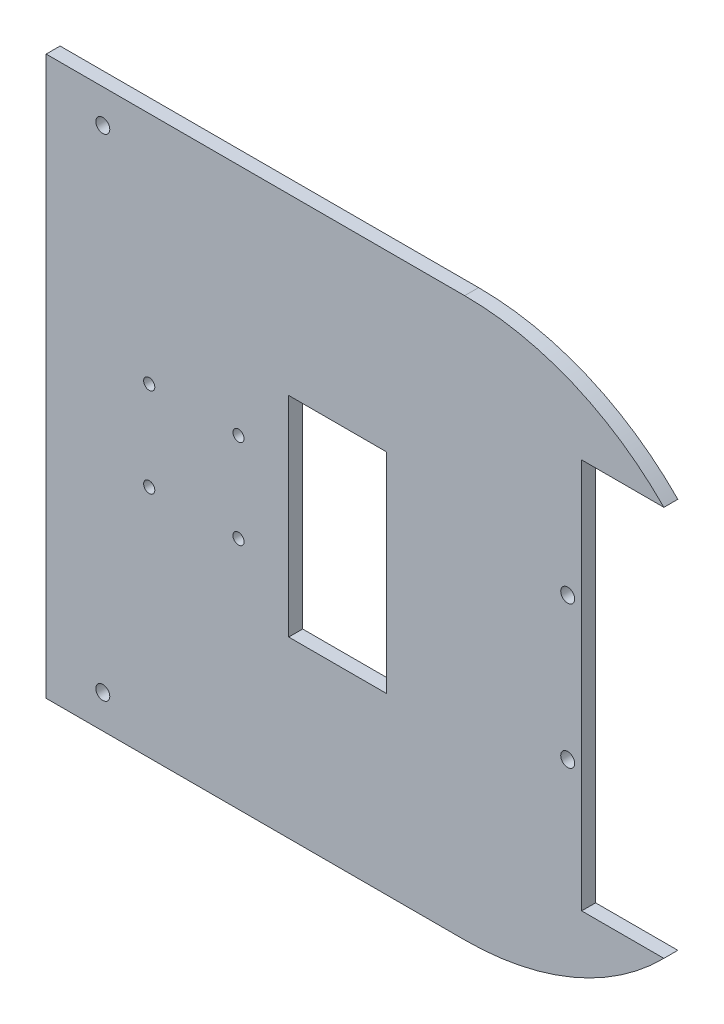
ISO-10303-21;
HEADER;
FILE_DESCRIPTION(('STEP AP214'),'2;1');
FILE_NAME('part.step','',(''),(''),'','','');
FILE_SCHEMA(('AUTOMOTIVE_DESIGN { 1 0 10303 214 1 1 1 1 }'));
ENDSEC;
DATA;
#1=APPLICATION_CONTEXT('core data for automotive mechanical design processes');
#2=APPLICATION_PROTOCOL_DEFINITION('international standard','automotive_design',2000,#1);
#3=PRODUCT_CONTEXT('',#1,'mechanical');
#4=PRODUCT('Part','Part','',(#3));
#5=PRODUCT_RELATED_PRODUCT_CATEGORY('part','',(#4));
#6=PRODUCT_DEFINITION_FORMATION('','',#4);
#7=PRODUCT_DEFINITION_CONTEXT('part definition',#1,'design');
#8=PRODUCT_DEFINITION('design','',#6,#7);
#9=PRODUCT_DEFINITION_SHAPE('','',#8);
#10=(LENGTH_UNIT() NAMED_UNIT(*) SI_UNIT(.MILLI.,.METRE.));
#11=(NAMED_UNIT(*) PLANE_ANGLE_UNIT() SI_UNIT($,.RADIAN.));
#12=(NAMED_UNIT(*) SI_UNIT($,.STERADIAN.) SOLID_ANGLE_UNIT());
#13=UNCERTAINTY_MEASURE_WITH_UNIT(LENGTH_MEASURE(1.E-05),#10,'distance_accuracy_value','');
#14=(GEOMETRIC_REPRESENTATION_CONTEXT(3) GLOBAL_UNCERTAINTY_ASSIGNED_CONTEXT((#13)) GLOBAL_UNIT_ASSIGNED_CONTEXT((#10,
#11,#12)) REPRESENTATION_CONTEXT('',''));
#15=CARTESIAN_POINT('',(0.,0.,0.));
#16=DIRECTION('',(0.,0.,1.));
#17=DIRECTION('',(1.,0.,0.));
#18=AXIS2_PLACEMENT_3D('',#15,#16,#17);
#19=CARTESIAN_POINT('',(0.,180.635083268963,-5.));
#20=DIRECTION('',(0.,-1.,0.));
#21=DIRECTION('',(1.,0.,0.));
#22=AXIS2_PLACEMENT_3D('',#19,#20,#21);
#23=PLANE('',#22);
#24=DIRECTION('',(1.,0.,0.));
#25=VECTOR('',#24,1.);
#26=CARTESIAN_POINT('',(0.,180.635083268963,-5.));
#27=LINE('',#26,#25);
#28=CARTESIAN_POINT('',(-114.937262470254,180.635083268963,-5.));
#29=VERTEX_POINT('',#28);
#30=CARTESIAN_POINT('',(35.0627375297462,180.635083268963,-5.));
#31=VERTEX_POINT('',#30);
#32=EDGE_CURVE('E132',#29,#31,#27,.T.);
#33=ORIENTED_EDGE('',*,*,#32,.F.);
#34=DIRECTION('',(0.,0.,-1.));
#35=VECTOR('',#34,1.);
#36=CARTESIAN_POINT('',(-114.937262470254,180.635083268963,5.));
#37=LINE('',#36,#35);
#38=CARTESIAN_POINT('',(-114.937262470254,180.635083268963,0.));
#39=VERTEX_POINT('',#38);
#40=EDGE_CURVE('E121',#39,#29,#37,.T.);
#41=ORIENTED_EDGE('',*,*,#40,.F.);
#42=DIRECTION('',(1.,0.,0.));
#43=VECTOR('',#42,1.);
#44=CARTESIAN_POINT('',(0.,180.635083268963,0.));
#45=LINE('',#44,#43);
#46=CARTESIAN_POINT('',(35.0627375297462,180.635083268963,0.));
#47=VERTEX_POINT('',#46);
#48=EDGE_CURVE('E159',#39,#47,#45,.T.);
#49=ORIENTED_EDGE('',*,*,#48,.T.);
#50=DIRECTION('',(0.,0.,1.));
#51=VECTOR('',#50,1.);
#52=CARTESIAN_POINT('',(35.0627375297462,180.635083268963,-5.));
#53=LINE('',#52,#51);
#54=EDGE_CURVE('E139',#31,#47,#53,.T.);
#55=ORIENTED_EDGE('',*,*,#54,.F.);
#56=EDGE_LOOP('',(#33,#41,#49,#55));
#57=FACE_BOUND('',#56,.T.);
#58=ADVANCED_FACE('F35',(#57),#23,.F.);
#59=CARTESIAN_POINT('',(35.0627375297462,80.6350832689628,-5.));
#60=DIRECTION('',(0.,0.,1.));
#61=DIRECTION('',(1.,0.,0.));
#62=AXIS2_PLACEMENT_3D('',#59,#60,#61);
#63=CYLINDRICAL_SURFACE('',#62,99.9999999999999);
#64=CARTESIAN_POINT('',(35.0627375297462,80.6350832689628,0.));
#65=DIRECTION('',(0.,0.,1.));
#66=DIRECTION('',(1.,0.,0.));
#67=AXIS2_PLACEMENT_3D('',#64,#65,#66);
#68=CIRCLE('',#67,99.9999999999999);
#69=CARTESIAN_POINT('',(106.477021815175,150.635083268963,0.));
#70=VERTEX_POINT('',#69);
#71=EDGE_CURVE('E140',#47,#70,#68,.F.);
#72=ORIENTED_EDGE('',*,*,#71,.T.);
#73=DIRECTION('',(0.,0.,1.));
#74=VECTOR('',#73,1.);
#75=CARTESIAN_POINT('',(106.477021815175,150.635083268963,-5.));
#76=LINE('',#75,#74);
#77=CARTESIAN_POINT('',(106.477021815175,150.635083268963,-5.));
#78=VERTEX_POINT('',#77);
#79=EDGE_CURVE('E172',#78,#70,#76,.T.);
#80=ORIENTED_EDGE('',*,*,#79,.F.);
#81=CARTESIAN_POINT('',(35.0627375297462,80.6350832689628,-5.));
#82=DIRECTION('',(0.,0.,1.));
#83=DIRECTION('',(1.,0.,0.));
#84=AXIS2_PLACEMENT_3D('',#81,#82,#83);
#85=CIRCLE('',#84,99.9999999999999);
#86=EDGE_CURVE('E153',#31,#78,#85,.F.);
#87=ORIENTED_EDGE('',*,*,#86,.F.);
#88=ORIENTED_EDGE('',*,*,#54,.T.);
#89=EDGE_LOOP('',(#72,#80,#87,#88));
#90=FACE_BOUND('',#89,.T.);
#91=ADVANCED_FACE('F287',(#90),#63,.T.);
#92=CARTESIAN_POINT('',(-1.4183805508757E-13,150.635083268963,-5.));
#93=DIRECTION('',(0.,1.,0.));
#94=DIRECTION('',(-1.,0.,0.));
#95=AXIS2_PLACEMENT_3D('',#92,#93,#94);
#96=PLANE('',#95);
#97=DIRECTION('',(-1.,0.,0.));
#98=VECTOR('',#97,1.);
#99=CARTESIAN_POINT('',(-1.4183805508757E-13,150.635083268963,0.));
#100=LINE('',#99,#98);
#101=CARTESIAN_POINT('',(77.,150.635083268963,0.));
#102=VERTEX_POINT('',#101);
#103=EDGE_CURVE('E144',#70,#102,#100,.T.);
#104=ORIENTED_EDGE('',*,*,#103,.T.);
#105=DIRECTION('',(0.,0.,1.));
#106=VECTOR('',#105,1.);
#107=CARTESIAN_POINT('',(77.,150.635083268963,-5.));
#108=LINE('',#107,#106);
#109=CARTESIAN_POINT('',(77.,150.635083268963,-5.));
#110=VERTEX_POINT('',#109);
#111=EDGE_CURVE('E175',#110,#102,#108,.T.);
#112=ORIENTED_EDGE('',*,*,#111,.F.);
#113=DIRECTION('',(-1.,0.,0.));
#114=VECTOR('',#113,1.);
#115=CARTESIAN_POINT('',(-1.4183805508757E-13,150.635083268963,-5.));
#116=LINE('',#115,#114);
#117=EDGE_CURVE('E157',#78,#110,#116,.T.);
#118=ORIENTED_EDGE('',*,*,#117,.F.);
#119=ORIENTED_EDGE('',*,*,#79,.T.);
#120=EDGE_LOOP('',(#104,#112,#118,#119));
#121=FACE_BOUND('',#120,.T.);
#122=ADVANCED_FACE('F293',(#121),#96,.F.);
#123=CARTESIAN_POINT('',(77.,0.,-5.));
#124=DIRECTION('',(-1.,0.,0.));
#125=DIRECTION('',(0.,-1.,0.));
#126=AXIS2_PLACEMENT_3D('',#123,#124,#125);
#127=PLANE('',#126);
#128=DIRECTION('',(0.,-1.,0.));
#129=VECTOR('',#128,1.);
#130=CARTESIAN_POINT('',(77.,0.,0.));
#131=LINE('',#130,#129);
#132=CARTESIAN_POINT('',(77.,10.6350832689629,0.));
#133=VERTEX_POINT('',#132);
#134=EDGE_CURVE('E167',#102,#133,#131,.T.);
#135=ORIENTED_EDGE('',*,*,#134,.T.);
#136=DIRECTION('',(0.,0.,1.));
#137=VECTOR('',#136,1.);
#138=CARTESIAN_POINT('',(77.,10.6350832689629,-5.));
#139=LINE('',#138,#137);
#140=CARTESIAN_POINT('',(77.,10.6350832689629,-5.));
#141=VERTEX_POINT('',#140);
#142=EDGE_CURVE('E178',#141,#133,#139,.T.);
#143=ORIENTED_EDGE('',*,*,#142,.F.);
#144=DIRECTION('',(0.,-1.,0.));
#145=VECTOR('',#144,1.);
#146=CARTESIAN_POINT('',(77.,0.,-5.));
#147=LINE('',#146,#145);
#148=EDGE_CURVE('E155',#110,#141,#147,.T.);
#149=ORIENTED_EDGE('',*,*,#148,.F.);
#150=ORIENTED_EDGE('',*,*,#111,.T.);
#151=EDGE_LOOP('',(#135,#143,#149,#150));
#152=FACE_BOUND('',#151,.T.);
#153=ADVANCED_FACE('F300',(#152),#127,.F.);
#154=CARTESIAN_POINT('',(0.,10.6350832689629,-5.));
#155=DIRECTION('',(0.,-1.,0.));
#156=DIRECTION('',(1.,0.,0.));
#157=AXIS2_PLACEMENT_3D('',#154,#155,#156);
#158=PLANE('',#157);
#159=DIRECTION('',(1.,0.,0.));
#160=VECTOR('',#159,1.);
#161=CARTESIAN_POINT('',(0.,10.6350832689629,0.));
#162=LINE('',#161,#160);
#163=CARTESIAN_POINT('',(106.477021815175,10.6350832689629,0.));
#164=VERTEX_POINT('',#163);
#165=EDGE_CURVE('E165',#133,#164,#162,.T.);
#166=ORIENTED_EDGE('',*,*,#165,.T.);
#167=DIRECTION('',(0.,0.,1.));
#168=VECTOR('',#167,1.);
#169=CARTESIAN_POINT('',(106.477021815175,10.6350832689629,-5.));
#170=LINE('',#169,#168);
#171=CARTESIAN_POINT('',(106.477021815175,10.6350832689629,-5.));
#172=VERTEX_POINT('',#171);
#173=EDGE_CURVE('E181',#172,#164,#170,.T.);
#174=ORIENTED_EDGE('',*,*,#173,.F.);
#175=DIRECTION('',(1.,0.,0.));
#176=VECTOR('',#175,1.);
#177=CARTESIAN_POINT('',(0.,10.6350832689629,-5.));
#178=LINE('',#177,#176);
#179=EDGE_CURVE('E152',#141,#172,#178,.T.);
#180=ORIENTED_EDGE('',*,*,#179,.F.);
#181=ORIENTED_EDGE('',*,*,#142,.T.);
#182=EDGE_LOOP('',(#166,#174,#180,#181));
#183=FACE_BOUND('',#182,.T.);
#184=ADVANCED_FACE('F306',(#183),#158,.F.);
#185=CARTESIAN_POINT('',(35.0627375297462,-19.3649167310371,0.));
#186=VERTEX_POINT('',#185);
#187=EDGE_CURVE('E146',#164,#186,#68,.F.);
#188=ORIENTED_EDGE('',*,*,#187,.T.);
#189=DIRECTION('',(0.,0.,1.));
#190=VECTOR('',#189,1.);
#191=CARTESIAN_POINT('',(35.0627375297462,-19.3649167310371,-5.));
#192=LINE('',#191,#190);
#193=CARTESIAN_POINT('',(35.0627375297462,-19.3649167310371,-5.));
#194=VERTEX_POINT('',#193);
#195=EDGE_CURVE('E184',#194,#186,#192,.T.);
#196=ORIENTED_EDGE('',*,*,#195,.F.);
#197=EDGE_CURVE('E142',#172,#194,#85,.F.);
#198=ORIENTED_EDGE('',*,*,#197,.F.);
#199=ORIENTED_EDGE('',*,*,#173,.T.);
#200=EDGE_LOOP('',(#188,#196,#198,#199));
#201=FACE_BOUND('',#200,.T.);
#202=ADVANCED_FACE('F296',(#201),#63,.T.);
#203=CARTESIAN_POINT('',(0.,-19.3649167310371,-5.));
#204=DIRECTION('',(0.,-1.,0.));
#205=DIRECTION('',(0.,0.,-1.));
#206=AXIS2_PLACEMENT_3D('',#203,#204,#205);
#207=PLANE('',#206);
#208=DIRECTION('',(0.,0.,-1.));
#209=VECTOR('',#208,1.);
#210=CARTESIAN_POINT('',(-114.937262470254,-19.3649167310371,5.));
#211=LINE('',#210,#209);
#212=CARTESIAN_POINT('',(-114.937262470254,-19.3649167310371,0.));
#213=VERTEX_POINT('',#212);
#214=CARTESIAN_POINT('',(-114.937262470254,-19.3649167310371,-5.));
#215=VERTEX_POINT('',#214);
#216=EDGE_CURVE('E48',#213,#215,#211,.T.);
#217=ORIENTED_EDGE('',*,*,#216,.T.);
#218=DIRECTION('',(1.,0.,0.));
#219=VECTOR('',#218,1.);
#220=CARTESIAN_POINT('',(0.,-19.3649167310371,-5.));
#221=LINE('',#220,#219);
#222=EDGE_CURVE('E135',#215,#194,#221,.T.);
#223=ORIENTED_EDGE('',*,*,#222,.T.);
#224=ORIENTED_EDGE('',*,*,#195,.T.);
#225=DIRECTION('',(1.,0.,0.));
#226=VECTOR('',#225,1.);
#227=CARTESIAN_POINT('',(0.,-19.3649167310371,0.));
#228=LINE('',#227,#226);
#229=EDGE_CURVE('E161',#213,#186,#228,.T.);
#230=ORIENTED_EDGE('',*,*,#229,.F.);
#231=EDGE_LOOP('',(#217,#223,#224,#230));
#232=FACE_BOUND('',#231,.T.);
#233=ADVANCED_FACE('F305',(#232),#207,.T.);
#234=CARTESIAN_POINT('',(0.,0.,-5.));
#235=DIRECTION('',(0.,0.,1.));
#236=DIRECTION('',(1.,0.,0.));
#237=AXIS2_PLACEMENT_3D('',#234,#235,#236);
#238=PLANE('',#237);
#239=CARTESIAN_POINT('',(-94.6372624702538,-7.36491673103717,-5.));
#240=DIRECTION('',(0.,0.,-1.));
#241=DIRECTION('',(1.,0.,0.));
#242=AXIS2_PLACEMENT_3D('',#239,#240,#241);
#243=CIRCLE('',#242,2.5);
#244=CARTESIAN_POINT('',(-92.1372624702537,-7.36491673103717,-5.));
#245=VERTEX_POINT('',#244);
#246=EDGE_CURVE('E489',#245,#245,#243,.T.);
#247=ORIENTED_EDGE('',*,*,#246,.F.);
#248=EDGE_LOOP('',(#247));
#249=FACE_BOUND('',#248,.T.);
#250=CARTESIAN_POINT('',(-94.6372624702538,168.635083268963,-5.));
#251=DIRECTION('',(0.,0.,-1.));
#252=DIRECTION('',(-1.,0.,0.));
#253=AXIS2_PLACEMENT_3D('',#250,#251,#252);
#254=CIRCLE('',#253,2.5);
#255=CARTESIAN_POINT('',(-97.1372624702538,168.635083268963,-5.));
#256=VERTEX_POINT('',#255);
#257=EDGE_CURVE('E217',#256,#256,#254,.T.);
#258=ORIENTED_EDGE('',*,*,#257,.F.);
#259=EDGE_LOOP('',(#258));
#260=FACE_BOUND('',#259,.T.);
#261=CARTESIAN_POINT('',(-78.,96.6950832689628,-5.));
#262=DIRECTION('',(0.,0.,-1.));
#263=DIRECTION('',(-1.,0.,0.));
#264=AXIS2_PLACEMENT_3D('',#261,#262,#263);
#265=CIRCLE('',#264,2.);
#266=CARTESIAN_POINT('',(-80.,96.6950832689628,-5.));
#267=VERTEX_POINT('',#266);
#268=EDGE_CURVE('E219',#267,#267,#265,.T.);
#269=ORIENTED_EDGE('',*,*,#268,.F.);
#270=EDGE_LOOP('',(#269));
#271=FACE_BOUND('',#270,.T.);
#272=CARTESIAN_POINT('',(-78.,64.6950832689629,-5.));
#273=DIRECTION('',(0.,0.,-1.));
#274=DIRECTION('',(-1.,0.,0.));
#275=AXIS2_PLACEMENT_3D('',#272,#273,#274);
#276=CIRCLE('',#275,2.);
#277=CARTESIAN_POINT('',(-80.,64.6950832689629,-5.));
#278=VERTEX_POINT('',#277);
#279=EDGE_CURVE('E223',#278,#278,#276,.T.);
#280=ORIENTED_EDGE('',*,*,#279,.F.);
#281=EDGE_LOOP('',(#280));
#282=FACE_BOUND('',#281,.T.);
#283=CARTESIAN_POINT('',(-46.,96.6950832689628,-5.));
#284=DIRECTION('',(0.,0.,-1.));
#285=DIRECTION('',(-1.,0.,0.));
#286=AXIS2_PLACEMENT_3D('',#283,#284,#285);
#287=CIRCLE('',#286,2.);
#288=CARTESIAN_POINT('',(-48.,96.6950832689628,-5.));
#289=VERTEX_POINT('',#288);
#290=EDGE_CURVE('E228',#289,#289,#287,.T.);
#291=ORIENTED_EDGE('',*,*,#290,.F.);
#292=EDGE_LOOP('',(#291));
#293=FACE_BOUND('',#292,.T.);
#294=CARTESIAN_POINT('',(-46.,64.6950832689629,-5.));
#295=DIRECTION('',(0.,0.,-1.));
#296=DIRECTION('',(-1.,0.,0.));
#297=AXIS2_PLACEMENT_3D('',#294,#295,#296);
#298=CIRCLE('',#297,2.);
#299=CARTESIAN_POINT('',(-48.,64.6950832689629,-5.));
#300=VERTEX_POINT('',#299);
#301=EDGE_CURVE('E204',#300,#300,#298,.T.);
#302=ORIENTED_EDGE('',*,*,#301,.F.);
#303=EDGE_LOOP('',(#302));
#304=FACE_BOUND('',#303,.T.);
#305=CARTESIAN_POINT('',(72.,55.1350832689628,-5.));
#306=DIRECTION('',(0.,0.,-1.));
#307=DIRECTION('',(-1.,0.,0.));
#308=AXIS2_PLACEMENT_3D('',#305,#306,#307);
#309=CIRCLE('',#308,2.50000000000002);
#310=CARTESIAN_POINT('',(69.4999999999999,55.1350832689628,-5.));
#311=VERTEX_POINT('',#310);
#312=EDGE_CURVE('E239',#311,#311,#309,.T.);
#313=ORIENTED_EDGE('',*,*,#312,.F.);
#314=EDGE_LOOP('',(#313));
#315=FACE_BOUND('',#314,.T.);
#316=DIRECTION('',(1.,0.,0.));
#317=VECTOR('',#316,1.);
#318=CARTESIAN_POINT('',(-28.,118.135083268963,-5.));
#319=LINE('',#318,#317);
#320=CARTESIAN_POINT('',(-28.,118.135083268963,-5.));
#321=VERTEX_POINT('',#320);
#322=CARTESIAN_POINT('',(7.00000000000009,118.135083268963,-5.));
#323=VERTEX_POINT('',#322);
#324=EDGE_CURVE('E243',#321,#323,#319,.T.);
#325=ORIENTED_EDGE('',*,*,#324,.F.);
#326=DIRECTION('',(0.,1.,0.));
#327=VECTOR('',#326,1.);
#328=CARTESIAN_POINT('',(-28.,118.135083268963,-5.));
#329=LINE('',#328,#327);
#330=CARTESIAN_POINT('',(-27.9999999999999,43.1350832689629,-5.));
#331=VERTEX_POINT('',#330);
#332=EDGE_CURVE('E56',#331,#321,#329,.T.);
#333=ORIENTED_EDGE('',*,*,#332,.F.);
#334=DIRECTION('',(-1.,0.,0.));
#335=VECTOR('',#334,1.);
#336=CARTESIAN_POINT('',(-27.9999999999999,43.1350832689629,-5.));
#337=LINE('',#336,#335);
#338=CARTESIAN_POINT('',(7.00000000000006,43.1350832689629,-5.));
#339=VERTEX_POINT('',#338);
#340=EDGE_CURVE('E249',#339,#331,#337,.T.);
#341=ORIENTED_EDGE('',*,*,#340,.F.);
#342=DIRECTION('',(0.,-1.,0.));
#343=VECTOR('',#342,1.);
#344=CARTESIAN_POINT('',(7.00000000000009,118.135083268963,-5.));
#345=LINE('',#344,#343);
#346=EDGE_CURVE('E246',#323,#339,#345,.T.);
#347=ORIENTED_EDGE('',*,*,#346,.F.);
#348=EDGE_LOOP('',(#325,#333,#341,#347));
#349=FACE_BOUND('',#348,.T.);
#350=CARTESIAN_POINT('',(72.,106.135083268963,-5.));
#351=DIRECTION('',(0.,0.,-1.));
#352=DIRECTION('',(1.,0.,0.));
#353=AXIS2_PLACEMENT_3D('',#350,#351,#352);
#354=CIRCLE('',#353,2.50000000000002);
#355=CARTESIAN_POINT('',(74.5,106.135083268963,-5.));
#356=VERTEX_POINT('',#355);
#357=EDGE_CURVE('E213',#356,#356,#354,.T.);
#358=ORIENTED_EDGE('',*,*,#357,.F.);
#359=EDGE_LOOP('',(#358));
#360=FACE_BOUND('',#359,.T.);
#361=ORIENTED_EDGE('',*,*,#222,.F.);
#362=DIRECTION('',(0.,-1.,0.));
#363=VECTOR('',#362,1.);
#364=CARTESIAN_POINT('',(-114.937262470254,180.635083268963,-5.));
#365=LINE('',#364,#363);
#366=EDGE_CURVE('E124',#29,#215,#365,.T.);
#367=ORIENTED_EDGE('',*,*,#366,.F.);
#368=ORIENTED_EDGE('',*,*,#32,.T.);
#369=ORIENTED_EDGE('',*,*,#86,.T.);
#370=ORIENTED_EDGE('',*,*,#117,.T.);
#371=ORIENTED_EDGE('',*,*,#148,.T.);
#372=ORIENTED_EDGE('',*,*,#179,.T.);
#373=ORIENTED_EDGE('',*,*,#197,.T.);
#374=EDGE_LOOP('',(#361,#367,#368,#369,#370,#371,#372,#373));
#375=FACE_BOUND('',#374,.T.);
#376=ADVANCED_FACE('F131',(#249,#260,#271,#282,#293,#304,#315,#349,#360,#375),#238,.F.);
#377=CARTESIAN_POINT('',(0.,0.,0.));
#378=DIRECTION('',(0.,0.,1.));
#379=DIRECTION('',(1.,0.,0.));
#380=AXIS2_PLACEMENT_3D('',#377,#378,#379);
#381=PLANE('',#380);
#382=DIRECTION('',(0.,1.,0.));
#383=VECTOR('',#382,1.);
#384=CARTESIAN_POINT('',(-114.937262470254,0.,0.));
#385=LINE('',#384,#383);
#386=EDGE_CURVE('E11',#213,#39,#385,.T.);
#387=ORIENTED_EDGE('',*,*,#386,.F.);
#388=ORIENTED_EDGE('',*,*,#229,.T.);
#389=ORIENTED_EDGE('',*,*,#187,.F.);
#390=ORIENTED_EDGE('',*,*,#165,.F.);
#391=ORIENTED_EDGE('',*,*,#134,.F.);
#392=ORIENTED_EDGE('',*,*,#103,.F.);
#393=ORIENTED_EDGE('',*,*,#71,.F.);
#394=ORIENTED_EDGE('',*,*,#48,.F.);
#395=EDGE_LOOP('',(#387,#388,#389,#390,#391,#392,#393,#394));
#396=FACE_BOUND('',#395,.T.);
#397=CARTESIAN_POINT('',(-94.6372624702538,-7.36491673103717,0.));
#398=DIRECTION('',(0.,0.,1.));
#399=DIRECTION('',(1.,0.,0.));
#400=AXIS2_PLACEMENT_3D('',#397,#398,#399);
#401=CIRCLE('',#400,2.5);
#402=CARTESIAN_POINT('',(-92.1372624702537,-7.36491673103717,0.));
#403=VERTEX_POINT('',#402);
#404=EDGE_CURVE('E216',#403,#403,#401,.T.);
#405=ORIENTED_EDGE('',*,*,#404,.F.);
#406=EDGE_LOOP('',(#405));
#407=FACE_BOUND('',#406,.T.);
#408=CARTESIAN_POINT('',(-94.6372624702538,168.635083268963,0.));
#409=DIRECTION('',(0.,0.,1.));
#410=DIRECTION('',(1.,0.,0.));
#411=AXIS2_PLACEMENT_3D('',#408,#409,#410);
#412=CIRCLE('',#411,2.5);
#413=CARTESIAN_POINT('',(-92.1372624702537,168.635083268963,0.));
#414=VERTEX_POINT('',#413);
#415=EDGE_CURVE('E214',#414,#414,#412,.T.);
#416=ORIENTED_EDGE('',*,*,#415,.F.);
#417=EDGE_LOOP('',(#416));
#418=FACE_BOUND('',#417,.T.);
#419=CARTESIAN_POINT('',(-78.,96.6950832689628,0.));
#420=DIRECTION('',(0.,0.,1.));
#421=DIRECTION('',(1.,0.,0.));
#422=AXIS2_PLACEMENT_3D('',#419,#420,#421);
#423=CIRCLE('',#422,2.);
#424=CARTESIAN_POINT('',(-76.,96.6950832689628,0.));
#425=VERTEX_POINT('',#424);
#426=EDGE_CURVE('E210',#425,#425,#423,.T.);
#427=ORIENTED_EDGE('',*,*,#426,.F.);
#428=EDGE_LOOP('',(#427));
#429=FACE_BOUND('',#428,.T.);
#430=CARTESIAN_POINT('',(-78.,64.6950832689629,0.));
#431=DIRECTION('',(0.,0.,1.));
#432=DIRECTION('',(1.,0.,0.));
#433=AXIS2_PLACEMENT_3D('',#430,#431,#432);
#434=CIRCLE('',#433,2.);
#435=CARTESIAN_POINT('',(-76.,64.6950832689629,0.));
#436=VERTEX_POINT('',#435);
#437=EDGE_CURVE('E207',#436,#436,#434,.T.);
#438=ORIENTED_EDGE('',*,*,#437,.F.);
#439=EDGE_LOOP('',(#438));
#440=FACE_BOUND('',#439,.T.);
#441=CARTESIAN_POINT('',(-46.,96.6950832689628,0.));
#442=DIRECTION('',(0.,0.,1.));
#443=DIRECTION('',(1.,0.,0.));
#444=AXIS2_PLACEMENT_3D('',#441,#442,#443);
#445=CIRCLE('',#444,2.);
#446=CARTESIAN_POINT('',(-44.,96.6950832689628,0.));
#447=VERTEX_POINT('',#446);
#448=EDGE_CURVE('E203',#447,#447,#445,.T.);
#449=ORIENTED_EDGE('',*,*,#448,.F.);
#450=EDGE_LOOP('',(#449));
#451=FACE_BOUND('',#450,.T.);
#452=CARTESIAN_POINT('',(-46.,64.6950832689629,0.));
#453=DIRECTION('',(0.,0.,1.));
#454=DIRECTION('',(1.,0.,0.));
#455=AXIS2_PLACEMENT_3D('',#452,#453,#454);
#456=CIRCLE('',#455,2.);
#457=CARTESIAN_POINT('',(-44.,64.6950832689629,0.));
#458=VERTEX_POINT('',#457);
#459=EDGE_CURVE('E200',#458,#458,#456,.T.);
#460=ORIENTED_EDGE('',*,*,#459,.F.);
#461=EDGE_LOOP('',(#460));
#462=FACE_BOUND('',#461,.T.);
#463=CARTESIAN_POINT('',(72.,55.1350832689628,0.));
#464=DIRECTION('',(0.,0.,1.));
#465=DIRECTION('',(1.,0.,0.));
#466=AXIS2_PLACEMENT_3D('',#463,#464,#465);
#467=CIRCLE('',#466,2.50000000000002);
#468=CARTESIAN_POINT('',(74.5,55.1350832689628,0.));
#469=VERTEX_POINT('',#468);
#470=EDGE_CURVE('E162',#469,#469,#467,.T.);
#471=ORIENTED_EDGE('',*,*,#470,.F.);
#472=EDGE_LOOP('',(#471));
#473=FACE_BOUND('',#472,.T.);
#474=DIRECTION('',(0.,-1.,0.));
#475=VECTOR('',#474,1.);
#476=CARTESIAN_POINT('',(-27.9999999999999,0.,0.));
#477=LINE('',#476,#475);
#478=CARTESIAN_POINT('',(-28.,118.135083268963,0.));
#479=VERTEX_POINT('',#478);
#480=CARTESIAN_POINT('',(-27.9999999999999,43.1350832689629,0.));
#481=VERTEX_POINT('',#480);
#482=EDGE_CURVE('E42',#479,#481,#477,.T.);
#483=ORIENTED_EDGE('',*,*,#482,.F.);
#484=DIRECTION('',(-1.,0.,0.));
#485=VECTOR('',#484,1.);
#486=CARTESIAN_POINT('',(0.,118.135083268963,0.));
#487=LINE('',#486,#485);
#488=CARTESIAN_POINT('',(7.00000000000009,118.135083268963,0.));
#489=VERTEX_POINT('',#488);
#490=EDGE_CURVE('E171',#489,#479,#487,.T.);
#491=ORIENTED_EDGE('',*,*,#490,.F.);
#492=DIRECTION('',(0.,1.,0.));
#493=VECTOR('',#492,1.);
#494=CARTESIAN_POINT('',(7.00000000000005,0.,0.));
#495=LINE('',#494,#493);
#496=CARTESIAN_POINT('',(7.00000000000006,43.1350832689629,0.));
#497=VERTEX_POINT('',#496);
#498=EDGE_CURVE('E192',#497,#489,#495,.T.);
#499=ORIENTED_EDGE('',*,*,#498,.F.);
#500=DIRECTION('',(1.,0.,0.));
#501=VECTOR('',#500,1.);
#502=CARTESIAN_POINT('',(0.,43.1350832689629,0.));
#503=LINE('',#502,#501);
#504=EDGE_CURVE('E195',#481,#497,#503,.T.);
#505=ORIENTED_EDGE('',*,*,#504,.F.);
#506=EDGE_LOOP('',(#483,#491,#499,#505));
#507=FACE_BOUND('',#506,.T.);
#508=CARTESIAN_POINT('',(72.,106.135083268963,0.));
#509=DIRECTION('',(0.,0.,1.));
#510=DIRECTION('',(1.,0.,0.));
#511=AXIS2_PLACEMENT_3D('',#508,#509,#510);
#512=CIRCLE('',#511,2.50000000000002);
#513=CARTESIAN_POINT('',(74.5,106.135083268963,0.));
#514=VERTEX_POINT('',#513);
#515=EDGE_CURVE('E187',#514,#514,#512,.T.);
#516=ORIENTED_EDGE('',*,*,#515,.F.);
#517=EDGE_LOOP('',(#516));
#518=FACE_BOUND('',#517,.T.);
#519=ADVANCED_FACE('F271',(#396,#407,#418,#429,#440,#451,#462,#473,#507,#518),#381,.T.);
#520=CARTESIAN_POINT('',(72.,106.135083268963,5.));
#521=DIRECTION('',(0.,0.,-1.));
#522=DIRECTION('',(-1.,0.,0.));
#523=AXIS2_PLACEMENT_3D('',#520,#521,#522);
#524=CYLINDRICAL_SURFACE('',#523,2.50000000000002);
#525=ORIENTED_EDGE('',*,*,#515,.T.);
#526=EDGE_LOOP('',(#525));
#527=FACE_BOUND('',#526,.T.);
#528=ORIENTED_EDGE('',*,*,#357,.T.);
#529=EDGE_LOOP('',(#528));
#530=FACE_BOUND('',#529,.T.);
#531=ADVANCED_FACE('F283',(#527,#530),#524,.F.);
#532=CARTESIAN_POINT('',(-28.,118.135083268963,5.));
#533=DIRECTION('',(-1.,0.,0.));
#534=DIRECTION('',(0.,-1.,0.));
#535=AXIS2_PLACEMENT_3D('',#532,#533,#534);
#536=PLANE('',#535);
#537=ORIENTED_EDGE('',*,*,#482,.T.);
#538=DIRECTION('',(0.,0.,-1.));
#539=VECTOR('',#538,1.);
#540=CARTESIAN_POINT('',(-27.9999999999999,43.1350832689629,5.));
#541=LINE('',#540,#539);
#542=EDGE_CURVE('E190',#481,#331,#541,.T.);
#543=ORIENTED_EDGE('',*,*,#542,.T.);
#544=ORIENTED_EDGE('',*,*,#332,.T.);
#545=DIRECTION('',(0.,0.,-1.));
#546=VECTOR('',#545,1.);
#547=CARTESIAN_POINT('',(-28.,118.135083268963,5.));
#548=LINE('',#547,#546);
#549=EDGE_CURVE('E148',#479,#321,#548,.T.);
#550=ORIENTED_EDGE('',*,*,#549,.F.);
#551=EDGE_LOOP('',(#537,#543,#544,#550));
#552=FACE_BOUND('',#551,.T.);
#553=ADVANCED_FACE('F274',(#552),#536,.F.);
#554=CARTESIAN_POINT('',(-27.9999999999999,43.1350832689629,5.));
#555=DIRECTION('',(0.,-1.,0.));
#556=DIRECTION('',(0.,0.,-1.));
#557=AXIS2_PLACEMENT_3D('',#554,#555,#556);
#558=PLANE('',#557);
#559=ORIENTED_EDGE('',*,*,#504,.T.);
#560=DIRECTION('',(0.,0.,-1.));
#561=VECTOR('',#560,1.);
#562=CARTESIAN_POINT('',(7.00000000000006,43.1350832689629,5.));
#563=LINE('',#562,#561);
#564=EDGE_CURVE('E253',#497,#339,#563,.T.);
#565=ORIENTED_EDGE('',*,*,#564,.T.);
#566=ORIENTED_EDGE('',*,*,#340,.T.);
#567=ORIENTED_EDGE('',*,*,#542,.F.);
#568=EDGE_LOOP('',(#559,#565,#566,#567));
#569=FACE_BOUND('',#568,.T.);
#570=ADVANCED_FACE('F275',(#569),#558,.F.);
#571=CARTESIAN_POINT('',(7.00000000000009,118.135083268963,5.));
#572=DIRECTION('',(1.,0.,0.));
#573=DIRECTION('',(0.,1.,0.));
#574=AXIS2_PLACEMENT_3D('',#571,#572,#573);
#575=PLANE('',#574);
#576=ORIENTED_EDGE('',*,*,#498,.T.);
#577=DIRECTION('',(0.,0.,-1.));
#578=VECTOR('',#577,1.);
#579=CARTESIAN_POINT('',(7.00000000000009,118.135083268963,5.));
#580=LINE('',#579,#578);
#581=EDGE_CURVE('E254',#489,#323,#580,.T.);
#582=ORIENTED_EDGE('',*,*,#581,.T.);
#583=ORIENTED_EDGE('',*,*,#346,.T.);
#584=ORIENTED_EDGE('',*,*,#564,.F.);
#585=EDGE_LOOP('',(#576,#582,#583,#584));
#586=FACE_BOUND('',#585,.T.);
#587=ADVANCED_FACE('F266',(#586),#575,.F.);
#588=CARTESIAN_POINT('',(-28.,118.135083268963,5.));
#589=DIRECTION('',(0.,1.,0.));
#590=DIRECTION('',(0.,0.,1.));
#591=AXIS2_PLACEMENT_3D('',#588,#589,#590);
#592=PLANE('',#591);
#593=ORIENTED_EDGE('',*,*,#490,.T.);
#594=ORIENTED_EDGE('',*,*,#549,.T.);
#595=ORIENTED_EDGE('',*,*,#324,.T.);
#596=ORIENTED_EDGE('',*,*,#581,.F.);
#597=EDGE_LOOP('',(#593,#594,#595,#596));
#598=FACE_BOUND('',#597,.T.);
#599=ADVANCED_FACE('F258',(#598),#592,.F.);
#600=CARTESIAN_POINT('',(72.,55.1350832689628,5.));
#601=DIRECTION('',(0.,0.,-1.));
#602=DIRECTION('',(-1.,0.,0.));
#603=AXIS2_PLACEMENT_3D('',#600,#601,#602);
#604=CYLINDRICAL_SURFACE('',#603,2.50000000000002);
#605=ORIENTED_EDGE('',*,*,#470,.T.);
#606=EDGE_LOOP('',(#605));
#607=FACE_BOUND('',#606,.T.);
#608=ORIENTED_EDGE('',*,*,#312,.T.);
#609=EDGE_LOOP('',(#608));
#610=FACE_BOUND('',#609,.T.);
#611=ADVANCED_FACE('F384',(#607,#610),#604,.F.);
#612=CARTESIAN_POINT('',(-46.,64.6950832689629,5.));
#613=DIRECTION('',(0.,0.,-1.));
#614=DIRECTION('',(-1.,0.,0.));
#615=AXIS2_PLACEMENT_3D('',#612,#613,#614);
#616=CYLINDRICAL_SURFACE('',#615,2.);
#617=ORIENTED_EDGE('',*,*,#459,.T.);
#618=EDGE_LOOP('',(#617));
#619=FACE_BOUND('',#618,.T.);
#620=ORIENTED_EDGE('',*,*,#301,.T.);
#621=EDGE_LOOP('',(#620));
#622=FACE_BOUND('',#621,.T.);
#623=ADVANCED_FACE('F393',(#619,#622),#616,.F.);
#624=CARTESIAN_POINT('',(-46.,96.6950832689628,5.));
#625=DIRECTION('',(0.,0.,-1.));
#626=DIRECTION('',(-1.,0.,0.));
#627=AXIS2_PLACEMENT_3D('',#624,#625,#626);
#628=CYLINDRICAL_SURFACE('',#627,2.);
#629=ORIENTED_EDGE('',*,*,#448,.T.);
#630=EDGE_LOOP('',(#629));
#631=FACE_BOUND('',#630,.T.);
#632=ORIENTED_EDGE('',*,*,#290,.T.);
#633=EDGE_LOOP('',(#632));
#634=FACE_BOUND('',#633,.T.);
#635=ADVANCED_FACE('F402',(#631,#634),#628,.F.);
#636=CARTESIAN_POINT('',(-78.,64.6950832689629,5.));
#637=DIRECTION('',(0.,0.,-1.));
#638=DIRECTION('',(-1.,0.,0.));
#639=AXIS2_PLACEMENT_3D('',#636,#637,#638);
#640=CYLINDRICAL_SURFACE('',#639,2.);
#641=ORIENTED_EDGE('',*,*,#437,.T.);
#642=EDGE_LOOP('',(#641));
#643=FACE_BOUND('',#642,.T.);
#644=ORIENTED_EDGE('',*,*,#279,.T.);
#645=EDGE_LOOP('',(#644));
#646=FACE_BOUND('',#645,.T.);
#647=ADVANCED_FACE('F412',(#643,#646),#640,.F.);
#648=CARTESIAN_POINT('',(-78.,96.6950832689628,5.));
#649=DIRECTION('',(0.,0.,-1.));
#650=DIRECTION('',(-1.,0.,0.));
#651=AXIS2_PLACEMENT_3D('',#648,#649,#650);
#652=CYLINDRICAL_SURFACE('',#651,2.);
#653=ORIENTED_EDGE('',*,*,#426,.T.);
#654=EDGE_LOOP('',(#653));
#655=FACE_BOUND('',#654,.T.);
#656=ORIENTED_EDGE('',*,*,#268,.T.);
#657=EDGE_LOOP('',(#656));
#658=FACE_BOUND('',#657,.T.);
#659=ADVANCED_FACE('F422',(#655,#658),#652,.F.);
#660=CARTESIAN_POINT('',(-94.6372624702538,168.635083268963,5.));
#661=DIRECTION('',(0.,0.,-1.));
#662=DIRECTION('',(-1.,0.,0.));
#663=AXIS2_PLACEMENT_3D('',#660,#661,#662);
#664=CYLINDRICAL_SURFACE('',#663,2.5);
#665=ORIENTED_EDGE('',*,*,#415,.T.);
#666=EDGE_LOOP('',(#665));
#667=FACE_BOUND('',#666,.T.);
#668=ORIENTED_EDGE('',*,*,#257,.T.);
#669=EDGE_LOOP('',(#668));
#670=FACE_BOUND('',#669,.T.);
#671=ADVANCED_FACE('F432',(#667,#670),#664,.F.);
#672=CARTESIAN_POINT('',(-94.6372624702538,-7.36491673103717,5.));
#673=DIRECTION('',(0.,0.,-1.));
#674=DIRECTION('',(-1.,0.,0.));
#675=AXIS2_PLACEMENT_3D('',#672,#673,#674);
#676=CYLINDRICAL_SURFACE('',#675,2.5);
#677=ORIENTED_EDGE('',*,*,#404,.T.);
#678=EDGE_LOOP('',(#677));
#679=FACE_BOUND('',#678,.T.);
#680=ORIENTED_EDGE('',*,*,#246,.T.);
#681=EDGE_LOOP('',(#680));
#682=FACE_BOUND('',#681,.T.);
#683=ADVANCED_FACE('F441',(#679,#682),#676,.F.);
#684=CARTESIAN_POINT('',(-114.937262470254,180.635083268963,5.));
#685=DIRECTION('',(1.,0.,0.));
#686=DIRECTION('',(0.,1.,0.));
#687=AXIS2_PLACEMENT_3D('',#684,#685,#686);
#688=PLANE('',#687);
#689=ORIENTED_EDGE('',*,*,#386,.T.);
#690=ORIENTED_EDGE('',*,*,#40,.T.);
#691=ORIENTED_EDGE('',*,*,#366,.T.);
#692=ORIENTED_EDGE('',*,*,#216,.F.);
#693=EDGE_LOOP('',(#689,#690,#691,#692));
#694=FACE_BOUND('',#693,.T.);
#695=ADVANCED_FACE('F123',(#694),#688,.F.);
#696=CLOSED_SHELL('',(#58,#91,#122,#153,#184,#202,#233,#376,#519,#531,#553,#570,#587,#599,#611,
#623,#635,#647,#659,#671,#683,#695));
#697=MANIFOLD_SOLID_BREP('B2',#696);
#698=ADVANCED_BREP_SHAPE_REPRESENTATION('',(#18,#697),#14);
#699=SHAPE_DEFINITION_REPRESENTATION(#9,#698);
ENDSEC;
END-ISO-10303-21;
